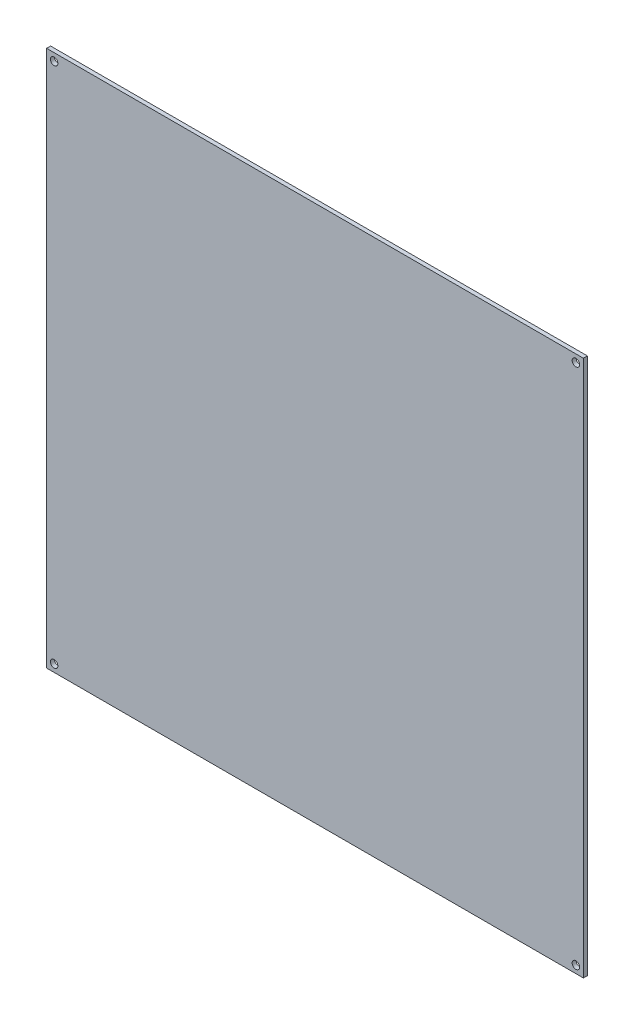
ISO-10303-21;
HEADER;
FILE_DESCRIPTION(('STEP AP214'),'2;1');
FILE_NAME('part.step','',(''),(''),'','','');
FILE_SCHEMA(('AUTOMOTIVE_DESIGN { 1 0 10303 214 1 1 1 1 }'));
ENDSEC;
DATA;
#1=APPLICATION_CONTEXT('core data for automotive mechanical design processes');
#2=APPLICATION_PROTOCOL_DEFINITION('international standard','automotive_design',2000,#1);
#3=PRODUCT_CONTEXT('',#1,'mechanical');
#4=PRODUCT('Part','Part','',(#3));
#5=PRODUCT_RELATED_PRODUCT_CATEGORY('part','',(#4));
#6=PRODUCT_DEFINITION_FORMATION('','',#4);
#7=PRODUCT_DEFINITION_CONTEXT('part definition',#1,'design');
#8=PRODUCT_DEFINITION('design','',#6,#7);
#9=PRODUCT_DEFINITION_SHAPE('','',#8);
#10=(LENGTH_UNIT() NAMED_UNIT(*) SI_UNIT(.MILLI.,.METRE.));
#11=(NAMED_UNIT(*) PLANE_ANGLE_UNIT() SI_UNIT($,.RADIAN.));
#12=(NAMED_UNIT(*) SI_UNIT($,.STERADIAN.) SOLID_ANGLE_UNIT());
#13=UNCERTAINTY_MEASURE_WITH_UNIT(LENGTH_MEASURE(1.E-05),#10,'distance_accuracy_value','');
#14=(GEOMETRIC_REPRESENTATION_CONTEXT(3) GLOBAL_UNCERTAINTY_ASSIGNED_CONTEXT((#13)) GLOBAL_UNIT_ASSIGNED_CONTEXT((#10,
#11,#12)) REPRESENTATION_CONTEXT('',''));
#15=CARTESIAN_POINT('',(0.,0.,0.));
#16=DIRECTION('',(0.,0.,1.));
#17=DIRECTION('',(1.,0.,0.));
#18=AXIS2_PLACEMENT_3D('',#15,#16,#17);
#19=CARTESIAN_POINT('',(107.5,-107.5,1.6));
#20=DIRECTION('',(-1.,0.,0.));
#21=DIRECTION('',(0.,0.,1.));
#22=AXIS2_PLACEMENT_3D('',#19,#20,#21);
#23=PLANE('',#22);
#24=DIRECTION('',(0.,1.,0.));
#25=VECTOR('',#24,1.);
#26=CARTESIAN_POINT('',(107.5,-107.5,0.));
#27=LINE('',#26,#25);
#28=CARTESIAN_POINT('',(107.5,-107.5,0.));
#29=VERTEX_POINT('',#28);
#30=CARTESIAN_POINT('',(107.5,107.5,0.));
#31=VERTEX_POINT('',#30);
#32=EDGE_CURVE('E96',#29,#31,#27,.T.);
#33=ORIENTED_EDGE('',*,*,#32,.T.);
#34=DIRECTION('',(0.,0.,-1.));
#35=VECTOR('',#34,1.);
#36=CARTESIAN_POINT('',(107.5,107.5,1.6));
#37=LINE('',#36,#35);
#38=CARTESIAN_POINT('',(107.5,107.5,1.6));
#39=VERTEX_POINT('',#38);
#40=EDGE_CURVE('E11',#39,#31,#37,.T.);
#41=ORIENTED_EDGE('',*,*,#40,.F.);
#42=DIRECTION('',(0.,1.,0.));
#43=VECTOR('',#42,1.);
#44=CARTESIAN_POINT('',(107.5,-107.5,1.6));
#45=LINE('',#44,#43);
#46=CARTESIAN_POINT('',(107.5,-107.5,1.6));
#47=VERTEX_POINT('',#46);
#48=EDGE_CURVE('E84',#47,#39,#45,.T.);
#49=ORIENTED_EDGE('',*,*,#48,.F.);
#50=DIRECTION('',(0.,0.,-1.));
#51=VECTOR('',#50,1.);
#52=CARTESIAN_POINT('',(107.5,-107.5,1.6));
#53=LINE('',#52,#51);
#54=EDGE_CURVE('E92',#47,#29,#53,.T.);
#55=ORIENTED_EDGE('',*,*,#54,.T.);
#56=EDGE_LOOP('',(#33,#41,#49,#55));
#57=FACE_BOUND('',#56,.T.);
#58=ADVANCED_FACE('F33',(#57),#23,.F.);
#59=CARTESIAN_POINT('',(-107.5,107.5,1.6));
#60=DIRECTION('',(0.,-1.,0.));
#61=DIRECTION('',(0.,0.,-1.));
#62=AXIS2_PLACEMENT_3D('',#59,#60,#61);
#63=PLANE('',#62);
#64=DIRECTION('',(-1.,0.,0.));
#65=VECTOR('',#64,1.);
#66=CARTESIAN_POINT('',(-107.5,107.5,0.));
#67=LINE('',#66,#65);
#68=CARTESIAN_POINT('',(-107.5,107.5,0.));
#69=VERTEX_POINT('',#68);
#70=EDGE_CURVE('E88',#31,#69,#67,.T.);
#71=ORIENTED_EDGE('',*,*,#70,.T.);
#72=DIRECTION('',(0.,0.,-1.));
#73=VECTOR('',#72,1.);
#74=CARTESIAN_POINT('',(-107.5,107.5,1.6));
#75=LINE('',#74,#73);
#76=CARTESIAN_POINT('',(-107.5,107.5,1.6));
#77=VERTEX_POINT('',#76);
#78=EDGE_CURVE('E41',#77,#69,#75,.T.);
#79=ORIENTED_EDGE('',*,*,#78,.F.);
#80=DIRECTION('',(-1.,0.,0.));
#81=VECTOR('',#80,1.);
#82=CARTESIAN_POINT('',(-107.5,107.5,1.6));
#83=LINE('',#82,#81);
#84=EDGE_CURVE('E79',#39,#77,#83,.T.);
#85=ORIENTED_EDGE('',*,*,#84,.F.);
#86=ORIENTED_EDGE('',*,*,#40,.T.);
#87=EDGE_LOOP('',(#71,#79,#85,#86));
#88=FACE_BOUND('',#87,.T.);
#89=ADVANCED_FACE('F87',(#88),#63,.F.);
#90=CARTESIAN_POINT('',(-107.5,-107.5,1.6));
#91=DIRECTION('',(1.,0.,0.));
#92=DIRECTION('',(0.,0.,-1.));
#93=AXIS2_PLACEMENT_3D('',#90,#91,#92);
#94=PLANE('',#93);
#95=DIRECTION('',(0.,-1.,0.));
#96=VECTOR('',#95,1.);
#97=CARTESIAN_POINT('',(-107.5,-107.5,0.));
#98=LINE('',#97,#96);
#99=CARTESIAN_POINT('',(-107.5,-107.5,0.));
#100=VERTEX_POINT('',#99);
#101=EDGE_CURVE('E66',#69,#100,#98,.T.);
#102=ORIENTED_EDGE('',*,*,#101,.T.);
#103=DIRECTION('',(0.,0.,-1.));
#104=VECTOR('',#103,1.);
#105=CARTESIAN_POINT('',(-107.5,-107.5,1.6));
#106=LINE('',#105,#104);
#107=CARTESIAN_POINT('',(-107.5,-107.5,1.6));
#108=VERTEX_POINT('',#107);
#109=EDGE_CURVE('E89',#108,#100,#106,.T.);
#110=ORIENTED_EDGE('',*,*,#109,.F.);
#111=DIRECTION('',(0.,-1.,0.));
#112=VECTOR('',#111,1.);
#113=CARTESIAN_POINT('',(-107.5,-107.5,1.6));
#114=LINE('',#113,#112);
#115=EDGE_CURVE('E82',#77,#108,#114,.T.);
#116=ORIENTED_EDGE('',*,*,#115,.F.);
#117=ORIENTED_EDGE('',*,*,#78,.T.);
#118=EDGE_LOOP('',(#102,#110,#116,#117));
#119=FACE_BOUND('',#118,.T.);
#120=ADVANCED_FACE('F90',(#119),#94,.F.);
#121=CARTESIAN_POINT('',(-107.5,-107.5,1.6));
#122=DIRECTION('',(0.,1.,0.));
#123=DIRECTION('',(0.,0.,1.));
#124=AXIS2_PLACEMENT_3D('',#121,#122,#123);
#125=PLANE('',#124);
#126=DIRECTION('',(1.,0.,0.));
#127=VECTOR('',#126,1.);
#128=CARTESIAN_POINT('',(-107.5,-107.5,0.));
#129=LINE('',#128,#127);
#130=EDGE_CURVE('E72',#100,#29,#129,.T.);
#131=ORIENTED_EDGE('',*,*,#130,.T.);
#132=ORIENTED_EDGE('',*,*,#54,.F.);
#133=DIRECTION('',(1.,0.,0.));
#134=VECTOR('',#133,1.);
#135=CARTESIAN_POINT('',(-107.5,-107.5,1.6));
#136=LINE('',#135,#134);
#137=EDGE_CURVE('E49',#108,#47,#136,.T.);
#138=ORIENTED_EDGE('',*,*,#137,.F.);
#139=ORIENTED_EDGE('',*,*,#109,.T.);
#140=EDGE_LOOP('',(#131,#132,#138,#139));
#141=FACE_BOUND('',#140,.T.);
#142=ADVANCED_FACE('F104',(#141),#125,.F.);
#143=CARTESIAN_POINT('',(0.,0.,1.6));
#144=DIRECTION('',(0.,0.,-1.));
#145=DIRECTION('',(-1.,0.,0.));
#146=AXIS2_PLACEMENT_3D('',#143,#144,#145);
#147=PLANE('',#146);
#148=CARTESIAN_POINT('',(-104.5,-104.5,1.6));
#149=DIRECTION('',(0.,0.,1.));
#150=DIRECTION('',(1.,0.,0.));
#151=AXIS2_PLACEMENT_3D('',#148,#149,#150);
#152=CIRCLE('',#151,1.5);
#153=CARTESIAN_POINT('',(-103.,-104.5,1.6));
#154=VERTEX_POINT('',#153);
#155=EDGE_CURVE('E128',#154,#154,#152,.T.);
#156=ORIENTED_EDGE('',*,*,#155,.F.);
#157=EDGE_LOOP('',(#156));
#158=FACE_BOUND('',#157,.T.);
#159=CARTESIAN_POINT('',(104.5,-104.5,1.6));
#160=DIRECTION('',(0.,0.,1.));
#161=DIRECTION('',(1.,0.,0.));
#162=AXIS2_PLACEMENT_3D('',#159,#160,#161);
#163=CIRCLE('',#162,1.5);
#164=CARTESIAN_POINT('',(106.,-104.5,1.6));
#165=VERTEX_POINT('',#164);
#166=EDGE_CURVE('E122',#165,#165,#163,.T.);
#167=ORIENTED_EDGE('',*,*,#166,.F.);
#168=EDGE_LOOP('',(#167));
#169=FACE_BOUND('',#168,.T.);
#170=CARTESIAN_POINT('',(104.5,104.5,1.6));
#171=DIRECTION('',(0.,0.,1.));
#172=DIRECTION('',(1.,0.,0.));
#173=AXIS2_PLACEMENT_3D('',#170,#171,#172);
#174=CIRCLE('',#173,1.5);
#175=CARTESIAN_POINT('',(106.,104.5,1.6));
#176=VERTEX_POINT('',#175);
#177=EDGE_CURVE('E116',#176,#176,#174,.T.);
#178=ORIENTED_EDGE('',*,*,#177,.F.);
#179=EDGE_LOOP('',(#178));
#180=FACE_BOUND('',#179,.T.);
#181=CARTESIAN_POINT('',(-104.5,104.5,1.6));
#182=DIRECTION('',(0.,0.,1.));
#183=DIRECTION('',(1.,0.,0.));
#184=AXIS2_PLACEMENT_3D('',#181,#182,#183);
#185=CIRCLE('',#184,1.5);
#186=CARTESIAN_POINT('',(-103.,104.5,1.6));
#187=VERTEX_POINT('',#186);
#188=EDGE_CURVE('E110',#187,#187,#185,.T.);
#189=ORIENTED_EDGE('',*,*,#188,.F.);
#190=EDGE_LOOP('',(#189));
#191=FACE_BOUND('',#190,.T.);
#192=ORIENTED_EDGE('',*,*,#48,.T.);
#193=ORIENTED_EDGE('',*,*,#84,.T.);
#194=ORIENTED_EDGE('',*,*,#115,.T.);
#195=ORIENTED_EDGE('',*,*,#137,.T.);
#196=EDGE_LOOP('',(#192,#193,#194,#195));
#197=FACE_BOUND('',#196,.T.);
#198=ADVANCED_FACE('F80',(#158,#169,#180,#191,#197),#147,.F.);
#199=CARTESIAN_POINT('',(0.,0.,0.));
#200=DIRECTION('',(0.,0.,-1.));
#201=DIRECTION('',(-1.,0.,0.));
#202=AXIS2_PLACEMENT_3D('',#199,#200,#201);
#203=PLANE('',#202);
#204=CARTESIAN_POINT('',(-104.5,-104.5,0.));
#205=DIRECTION('',(0.,0.,1.));
#206=DIRECTION('',(1.,0.,0.));
#207=AXIS2_PLACEMENT_3D('',#204,#205,#206);
#208=CIRCLE('',#207,1.5);
#209=CARTESIAN_POINT('',(-103.,-104.5,0.));
#210=VERTEX_POINT('',#209);
#211=EDGE_CURVE('E125',#210,#210,#208,.T.);
#212=ORIENTED_EDGE('',*,*,#211,.T.);
#213=EDGE_LOOP('',(#212));
#214=FACE_BOUND('',#213,.T.);
#215=CARTESIAN_POINT('',(104.5,-104.5,0.));
#216=DIRECTION('',(0.,0.,1.));
#217=DIRECTION('',(1.,0.,0.));
#218=AXIS2_PLACEMENT_3D('',#215,#216,#217);
#219=CIRCLE('',#218,1.5);
#220=CARTESIAN_POINT('',(106.,-104.5,0.));
#221=VERTEX_POINT('',#220);
#222=EDGE_CURVE('E119',#221,#221,#219,.T.);
#223=ORIENTED_EDGE('',*,*,#222,.T.);
#224=EDGE_LOOP('',(#223));
#225=FACE_BOUND('',#224,.T.);
#226=CARTESIAN_POINT('',(104.5,104.5,0.));
#227=DIRECTION('',(0.,0.,1.));
#228=DIRECTION('',(1.,0.,0.));
#229=AXIS2_PLACEMENT_3D('',#226,#227,#228);
#230=CIRCLE('',#229,1.5);
#231=CARTESIAN_POINT('',(106.,104.5,0.));
#232=VERTEX_POINT('',#231);
#233=EDGE_CURVE('E113',#232,#232,#230,.T.);
#234=ORIENTED_EDGE('',*,*,#233,.T.);
#235=EDGE_LOOP('',(#234));
#236=FACE_BOUND('',#235,.T.);
#237=CARTESIAN_POINT('',(-104.5,104.5,0.));
#238=DIRECTION('',(0.,0.,1.));
#239=DIRECTION('',(1.,0.,0.));
#240=AXIS2_PLACEMENT_3D('',#237,#238,#239);
#241=CIRCLE('',#240,1.5);
#242=CARTESIAN_POINT('',(-103.,104.5,0.));
#243=VERTEX_POINT('',#242);
#244=EDGE_CURVE('E99',#243,#243,#241,.T.);
#245=ORIENTED_EDGE('',*,*,#244,.T.);
#246=EDGE_LOOP('',(#245));
#247=FACE_BOUND('',#246,.T.);
#248=ORIENTED_EDGE('',*,*,#32,.F.);
#249=ORIENTED_EDGE('',*,*,#130,.F.);
#250=ORIENTED_EDGE('',*,*,#101,.F.);
#251=ORIENTED_EDGE('',*,*,#70,.F.);
#252=EDGE_LOOP('',(#248,#249,#250,#251));
#253=FACE_BOUND('',#252,.T.);
#254=ADVANCED_FACE('F107',(#214,#225,#236,#247,#253),#203,.T.);
#255=CARTESIAN_POINT('',(-104.5,104.5,0.));
#256=DIRECTION('',(0.,0.,1.));
#257=DIRECTION('',(1.,0.,0.));
#258=AXIS2_PLACEMENT_3D('',#255,#256,#257);
#259=CYLINDRICAL_SURFACE('',#258,1.5);
#260=ORIENTED_EDGE('',*,*,#244,.F.);
#261=EDGE_LOOP('',(#260));
#262=FACE_BOUND('',#261,.T.);
#263=ORIENTED_EDGE('',*,*,#188,.T.);
#264=EDGE_LOOP('',(#263));
#265=FACE_BOUND('',#264,.T.);
#266=ADVANCED_FACE('F152',(#262,#265),#259,.F.);
#267=CARTESIAN_POINT('',(104.5,104.5,0.));
#268=DIRECTION('',(0.,0.,1.));
#269=DIRECTION('',(1.,0.,0.));
#270=AXIS2_PLACEMENT_3D('',#267,#268,#269);
#271=CYLINDRICAL_SURFACE('',#270,1.5);
#272=ORIENTED_EDGE('',*,*,#233,.F.);
#273=EDGE_LOOP('',(#272));
#274=FACE_BOUND('',#273,.T.);
#275=ORIENTED_EDGE('',*,*,#177,.T.);
#276=EDGE_LOOP('',(#275));
#277=FACE_BOUND('',#276,.T.);
#278=ADVANCED_FACE('F154',(#274,#277),#271,.F.);
#279=CARTESIAN_POINT('',(104.5,-104.5,0.));
#280=DIRECTION('',(0.,0.,1.));
#281=DIRECTION('',(1.,0.,0.));
#282=AXIS2_PLACEMENT_3D('',#279,#280,#281);
#283=CYLINDRICAL_SURFACE('',#282,1.5);
#284=ORIENTED_EDGE('',*,*,#222,.F.);
#285=EDGE_LOOP('',(#284));
#286=FACE_BOUND('',#285,.T.);
#287=ORIENTED_EDGE('',*,*,#166,.T.);
#288=EDGE_LOOP('',(#287));
#289=FACE_BOUND('',#288,.T.);
#290=ADVANCED_FACE('F139',(#286,#289),#283,.F.);
#291=CARTESIAN_POINT('',(-104.5,-104.5,0.));
#292=DIRECTION('',(0.,0.,1.));
#293=DIRECTION('',(1.,0.,0.));
#294=AXIS2_PLACEMENT_3D('',#291,#292,#293);
#295=CYLINDRICAL_SURFACE('',#294,1.5);
#296=ORIENTED_EDGE('',*,*,#211,.F.);
#297=EDGE_LOOP('',(#296));
#298=FACE_BOUND('',#297,.T.);
#299=ORIENTED_EDGE('',*,*,#155,.T.);
#300=EDGE_LOOP('',(#299));
#301=FACE_BOUND('',#300,.T.);
#302=ADVANCED_FACE('F136',(#298,#301),#295,.F.);
#303=CLOSED_SHELL('',(#58,#89,#120,#142,#198,#254,#266,#278,#290,#302));
#304=MANIFOLD_SOLID_BREP('B2',#303);
#305=ADVANCED_BREP_SHAPE_REPRESENTATION('',(#18,#304),#14);
#306=SHAPE_DEFINITION_REPRESENTATION(#9,#305);
ENDSEC;
END-ISO-10303-21;
